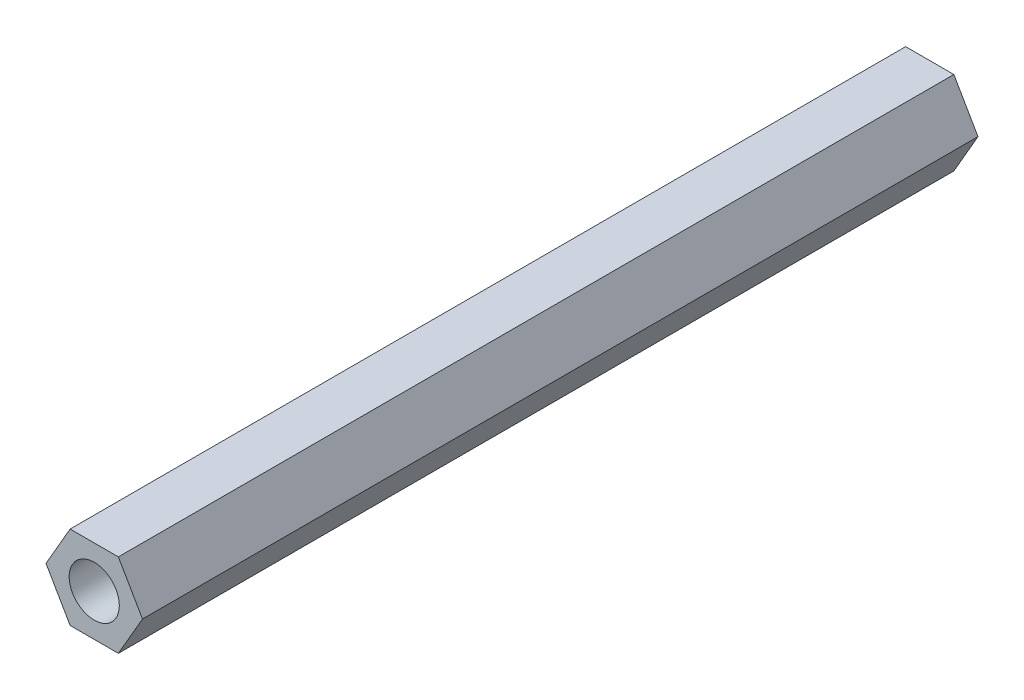
ISO-10303-21;
HEADER;
FILE_DESCRIPTION(('STEP AP214'),'2;1');
FILE_NAME('part.step','',(''),(''),'','','');
FILE_SCHEMA(('AUTOMOTIVE_DESIGN { 1 0 10303 214 1 1 1 1 }'));
ENDSEC;
DATA;
#1=APPLICATION_CONTEXT('core data for automotive mechanical design processes');
#2=APPLICATION_PROTOCOL_DEFINITION('international standard','automotive_design',2000,#1);
#3=PRODUCT_CONTEXT('',#1,'mechanical');
#4=PRODUCT('Part','Part','',(#3));
#5=PRODUCT_RELATED_PRODUCT_CATEGORY('part','',(#4));
#6=PRODUCT_DEFINITION_FORMATION('','',#4);
#7=PRODUCT_DEFINITION_CONTEXT('part definition',#1,'design');
#8=PRODUCT_DEFINITION('design','',#6,#7);
#9=PRODUCT_DEFINITION_SHAPE('','',#8);
#10=(LENGTH_UNIT() NAMED_UNIT(*) SI_UNIT(.MILLI.,.METRE.));
#11=(NAMED_UNIT(*) PLANE_ANGLE_UNIT() SI_UNIT($,.RADIAN.));
#12=(NAMED_UNIT(*) SI_UNIT($,.STERADIAN.) SOLID_ANGLE_UNIT());
#13=UNCERTAINTY_MEASURE_WITH_UNIT(LENGTH_MEASURE(1.E-05),#10,'distance_accuracy_value','');
#14=(GEOMETRIC_REPRESENTATION_CONTEXT(3) GLOBAL_UNCERTAINTY_ASSIGNED_CONTEXT((#13)) GLOBAL_UNIT_ASSIGNED_CONTEXT((#10,
#11,#12)) REPRESENTATION_CONTEXT('',''));
#15=CARTESIAN_POINT('',(0.,0.,0.));
#16=DIRECTION('',(0.,0.,1.));
#17=DIRECTION('',(1.,0.,0.));
#18=AXIS2_PLACEMENT_3D('',#15,#16,#17);
#19=CARTESIAN_POINT('',(1.44337567297406,-2.5,-50.));
#20=DIRECTION('',(0.866025403784439,-0.5,0.));
#21=DIRECTION('',(0.5,0.866025403784439,0.));
#22=AXIS2_PLACEMENT_3D('',#19,#20,#21);
#23=PLANE('',#22);
#24=DIRECTION('',(0.5,0.866025403784439,0.));
#25=VECTOR('',#24,1.);
#26=CARTESIAN_POINT('',(1.44337567297406,-2.5,0.));
#27=LINE('',#26,#25);
#28=CARTESIAN_POINT('',(1.44337567297406,-2.5,0.));
#29=VERTEX_POINT('',#28);
#30=CARTESIAN_POINT('',(2.88675134594813,0.,0.));
#31=VERTEX_POINT('',#30);
#32=EDGE_CURVE('E130',#29,#31,#27,.T.);
#33=ORIENTED_EDGE('',*,*,#32,.F.);
#34=DIRECTION('',(0.,0.,1.));
#35=VECTOR('',#34,1.);
#36=CARTESIAN_POINT('',(1.44337567297406,-2.5,-50.));
#37=LINE('',#36,#35);
#38=CARTESIAN_POINT('',(1.44337567297406,-2.5,-50.));
#39=VERTEX_POINT('',#38);
#40=EDGE_CURVE('E11',#39,#29,#37,.T.);
#41=ORIENTED_EDGE('',*,*,#40,.F.);
#42=DIRECTION('',(0.5,0.866025403784439,0.));
#43=VECTOR('',#42,1.);
#44=CARTESIAN_POINT('',(1.44337567297406,-2.5,-50.));
#45=LINE('',#44,#43);
#46=CARTESIAN_POINT('',(2.88675134594813,0.,-50.));
#47=VERTEX_POINT('',#46);
#48=EDGE_CURVE('E151',#39,#47,#45,.T.);
#49=ORIENTED_EDGE('',*,*,#48,.T.);
#50=DIRECTION('',(0.,0.,1.));
#51=VECTOR('',#50,1.);
#52=CARTESIAN_POINT('',(2.88675134594813,0.,-50.));
#53=LINE('',#52,#51);
#54=EDGE_CURVE('E42',#47,#31,#53,.T.);
#55=ORIENTED_EDGE('',*,*,#54,.T.);
#56=EDGE_LOOP('',(#33,#41,#49,#55));
#57=FACE_BOUND('',#56,.T.);
#58=ADVANCED_FACE('F39',(#57),#23,.T.);
#59=CARTESIAN_POINT('',(-1.44337567297406,-2.5,-50.));
#60=DIRECTION('',(0.,-1.,0.));
#61=DIRECTION('',(1.,0.,0.));
#62=AXIS2_PLACEMENT_3D('',#59,#60,#61);
#63=PLANE('',#62);
#64=DIRECTION('',(1.,0.,0.));
#65=VECTOR('',#64,1.);
#66=CARTESIAN_POINT('',(-1.44337567297406,-2.5,0.));
#67=LINE('',#66,#65);
#68=CARTESIAN_POINT('',(-1.44337567297406,-2.5,0.));
#69=VERTEX_POINT('',#68);
#70=EDGE_CURVE('E148',#69,#29,#67,.T.);
#71=ORIENTED_EDGE('',*,*,#70,.F.);
#72=DIRECTION('',(0.,0.,1.));
#73=VECTOR('',#72,1.);
#74=CARTESIAN_POINT('',(-1.44337567297406,-2.5,-50.));
#75=LINE('',#74,#73);
#76=CARTESIAN_POINT('',(-1.44337567297406,-2.5,-50.));
#77=VERTEX_POINT('',#76);
#78=EDGE_CURVE('E49',#77,#69,#75,.T.);
#79=ORIENTED_EDGE('',*,*,#78,.F.);
#80=DIRECTION('',(1.,0.,0.));
#81=VECTOR('',#80,1.);
#82=CARTESIAN_POINT('',(-1.44337567297406,-2.5,-50.));
#83=LINE('',#82,#81);
#84=EDGE_CURVE('E116',#77,#39,#83,.T.);
#85=ORIENTED_EDGE('',*,*,#84,.T.);
#86=ORIENTED_EDGE('',*,*,#40,.T.);
#87=EDGE_LOOP('',(#71,#79,#85,#86));
#88=FACE_BOUND('',#87,.T.);
#89=ADVANCED_FACE('F163',(#88),#63,.T.);
#90=CARTESIAN_POINT('',(-2.88675134594813,0.,-50.));
#91=DIRECTION('',(-0.866025403784439,-0.5,0.));
#92=DIRECTION('',(0.5,-0.866025403784439,0.));
#93=AXIS2_PLACEMENT_3D('',#90,#91,#92);
#94=PLANE('',#93);
#95=DIRECTION('',(0.5,-0.866025403784439,0.));
#96=VECTOR('',#95,1.);
#97=CARTESIAN_POINT('',(-2.88675134594813,0.,0.));
#98=LINE('',#97,#96);
#99=CARTESIAN_POINT('',(-2.88675134594813,0.,0.));
#100=VERTEX_POINT('',#99);
#101=EDGE_CURVE('E102',#100,#69,#98,.T.);
#102=ORIENTED_EDGE('',*,*,#101,.F.);
#103=DIRECTION('',(0.,0.,1.));
#104=VECTOR('',#103,1.);
#105=CARTESIAN_POINT('',(-2.88675134594813,0.,-50.));
#106=LINE('',#105,#104);
#107=CARTESIAN_POINT('',(-2.88675134594813,0.,-50.));
#108=VERTEX_POINT('',#107);
#109=EDGE_CURVE('E97',#108,#100,#106,.T.);
#110=ORIENTED_EDGE('',*,*,#109,.F.);
#111=DIRECTION('',(0.5,-0.866025403784439,0.));
#112=VECTOR('',#111,1.);
#113=CARTESIAN_POINT('',(-2.88675134594813,0.,-50.));
#114=LINE('',#113,#112);
#115=EDGE_CURVE('E100',#108,#77,#114,.T.);
#116=ORIENTED_EDGE('',*,*,#115,.T.);
#117=ORIENTED_EDGE('',*,*,#78,.T.);
#118=EDGE_LOOP('',(#102,#110,#116,#117));
#119=FACE_BOUND('',#118,.T.);
#120=ADVANCED_FACE('F99',(#119),#94,.T.);
#121=CARTESIAN_POINT('',(-1.44337567297406,2.5,-50.));
#122=DIRECTION('',(-0.866025403784439,0.5,0.));
#123=DIRECTION('',(-0.5,-0.866025403784439,0.));
#124=AXIS2_PLACEMENT_3D('',#121,#122,#123);
#125=PLANE('',#124);
#126=DIRECTION('',(-0.5,-0.866025403784439,0.));
#127=VECTOR('',#126,1.);
#128=CARTESIAN_POINT('',(-1.44337567297406,2.5,0.));
#129=LINE('',#128,#127);
#130=CARTESIAN_POINT('',(-1.44337567297406,2.5,0.));
#131=VERTEX_POINT('',#130);
#132=EDGE_CURVE('E143',#131,#100,#129,.T.);
#133=ORIENTED_EDGE('',*,*,#132,.F.);
#134=DIRECTION('',(0.,0.,1.));
#135=VECTOR('',#134,1.);
#136=CARTESIAN_POINT('',(-1.44337567297406,2.5,-50.));
#137=LINE('',#136,#135);
#138=CARTESIAN_POINT('',(-1.44337567297406,2.5,-50.));
#139=VERTEX_POINT('',#138);
#140=EDGE_CURVE('E108',#139,#131,#137,.T.);
#141=ORIENTED_EDGE('',*,*,#140,.F.);
#142=DIRECTION('',(-0.5,-0.866025403784439,0.));
#143=VECTOR('',#142,1.);
#144=CARTESIAN_POINT('',(-1.44337567297406,2.5,-50.));
#145=LINE('',#144,#143);
#146=EDGE_CURVE('E114',#139,#108,#145,.T.);
#147=ORIENTED_EDGE('',*,*,#146,.T.);
#148=ORIENTED_EDGE('',*,*,#109,.T.);
#149=EDGE_LOOP('',(#133,#141,#147,#148));
#150=FACE_BOUND('',#149,.T.);
#151=ADVANCED_FACE('F119',(#150),#125,.T.);
#152=CARTESIAN_POINT('',(1.44337567297406,2.5,-50.));
#153=DIRECTION('',(0.,1.,0.));
#154=DIRECTION('',(0.,0.,1.));
#155=AXIS2_PLACEMENT_3D('',#152,#153,#154);
#156=PLANE('',#155);
#157=DIRECTION('',(-1.,0.,0.));
#158=VECTOR('',#157,1.);
#159=CARTESIAN_POINT('',(1.44337567297406,2.5,0.));
#160=LINE('',#159,#158);
#161=CARTESIAN_POINT('',(1.44337567297406,2.5,0.));
#162=VERTEX_POINT('',#161);
#163=EDGE_CURVE('E139',#162,#131,#160,.T.);
#164=ORIENTED_EDGE('',*,*,#163,.F.);
#165=DIRECTION('',(0.,0.,1.));
#166=VECTOR('',#165,1.);
#167=CARTESIAN_POINT('',(1.44337567297406,2.5,-50.));
#168=LINE('',#167,#166);
#169=CARTESIAN_POINT('',(1.44337567297406,2.5,-50.));
#170=VERTEX_POINT('',#169);
#171=EDGE_CURVE('E156',#170,#162,#168,.T.);
#172=ORIENTED_EDGE('',*,*,#171,.F.);
#173=DIRECTION('',(-1.,0.,0.));
#174=VECTOR('',#173,1.);
#175=CARTESIAN_POINT('',(1.44337567297406,2.5,-50.));
#176=LINE('',#175,#174);
#177=EDGE_CURVE('E121',#170,#139,#176,.T.);
#178=ORIENTED_EDGE('',*,*,#177,.T.);
#179=ORIENTED_EDGE('',*,*,#140,.T.);
#180=EDGE_LOOP('',(#164,#172,#178,#179));
#181=FACE_BOUND('',#180,.T.);
#182=ADVANCED_FACE('F176',(#181),#156,.T.);
#183=CARTESIAN_POINT('',(2.88675134594813,0.,-50.));
#184=DIRECTION('',(0.866025403784439,0.5,0.));
#185=DIRECTION('',(-0.5,0.866025403784439,0.));
#186=AXIS2_PLACEMENT_3D('',#183,#184,#185);
#187=PLANE('',#186);
#188=DIRECTION('',(-0.5,0.866025403784439,0.));
#189=VECTOR('',#188,1.);
#190=CARTESIAN_POINT('',(2.88675134594813,0.,0.));
#191=LINE('',#190,#189);
#192=EDGE_CURVE('E134',#31,#162,#191,.T.);
#193=ORIENTED_EDGE('',*,*,#192,.F.);
#194=ORIENTED_EDGE('',*,*,#54,.F.);
#195=DIRECTION('',(-0.5,0.866025403784439,0.));
#196=VECTOR('',#195,1.);
#197=CARTESIAN_POINT('',(2.88675134594813,0.,-50.));
#198=LINE('',#197,#196);
#199=EDGE_CURVE('E124',#47,#170,#198,.T.);
#200=ORIENTED_EDGE('',*,*,#199,.T.);
#201=ORIENTED_EDGE('',*,*,#171,.T.);
#202=EDGE_LOOP('',(#193,#194,#200,#201));
#203=FACE_BOUND('',#202,.T.);
#204=ADVANCED_FACE('F160',(#203),#187,.T.);
#205=CARTESIAN_POINT('',(0.,0.,-50.));
#206=DIRECTION('',(0.,0.,1.));
#207=DIRECTION('',(1.,0.,0.));
#208=AXIS2_PLACEMENT_3D('',#205,#206,#207);
#209=PLANE('',#208);
#210=CARTESIAN_POINT('',(0.,0.,-50.));
#211=DIRECTION('',(0.,0.,1.));
#212=DIRECTION('',(1.,0.,0.));
#213=AXIS2_PLACEMENT_3D('',#210,#211,#212);
#214=CIRCLE('',#213,1.5);
#215=CARTESIAN_POINT('',(1.5,0.,-50.));
#216=VERTEX_POINT('',#215);
#217=EDGE_CURVE('E135',#216,#216,#214,.T.);
#218=ORIENTED_EDGE('',*,*,#217,.T.);
#219=EDGE_LOOP('',(#218));
#220=FACE_BOUND('',#219,.T.);
#221=ORIENTED_EDGE('',*,*,#48,.F.);
#222=ORIENTED_EDGE('',*,*,#84,.F.);
#223=ORIENTED_EDGE('',*,*,#115,.F.);
#224=ORIENTED_EDGE('',*,*,#146,.F.);
#225=ORIENTED_EDGE('',*,*,#177,.F.);
#226=ORIENTED_EDGE('',*,*,#199,.F.);
#227=EDGE_LOOP('',(#221,#222,#223,#224,#225,#226));
#228=FACE_BOUND('',#227,.T.);
#229=ADVANCED_FACE('F112',(#220,#228),#209,.F.);
#230=CARTESIAN_POINT('',(0.,0.,0.));
#231=DIRECTION('',(0.,0.,1.));
#232=DIRECTION('',(1.,0.,0.));
#233=AXIS2_PLACEMENT_3D('',#230,#231,#232);
#234=PLANE('',#233);
#235=CARTESIAN_POINT('',(0.,0.,0.));
#236=DIRECTION('',(0.,0.,1.));
#237=DIRECTION('',(1.,0.,0.));
#238=AXIS2_PLACEMENT_3D('',#235,#236,#237);
#239=CIRCLE('',#238,1.5);
#240=CARTESIAN_POINT('',(1.5,0.,0.));
#241=VERTEX_POINT('',#240);
#242=EDGE_CURVE('E199',#241,#241,#239,.T.);
#243=ORIENTED_EDGE('',*,*,#242,.F.);
#244=EDGE_LOOP('',(#243));
#245=FACE_BOUND('',#244,.T.);
#246=ORIENTED_EDGE('',*,*,#32,.T.);
#247=ORIENTED_EDGE('',*,*,#192,.T.);
#248=ORIENTED_EDGE('',*,*,#163,.T.);
#249=ORIENTED_EDGE('',*,*,#132,.T.);
#250=ORIENTED_EDGE('',*,*,#101,.T.);
#251=ORIENTED_EDGE('',*,*,#70,.T.);
#252=EDGE_LOOP('',(#246,#247,#248,#249,#250,#251));
#253=FACE_BOUND('',#252,.T.);
#254=ADVANCED_FACE('F162',(#245,#253),#234,.T.);
#255=CARTESIAN_POINT('',(0.,0.,-50.));
#256=DIRECTION('',(0.,0.,1.));
#257=DIRECTION('',(1.,0.,0.));
#258=AXIS2_PLACEMENT_3D('',#255,#256,#257);
#259=CYLINDRICAL_SURFACE('',#258,1.5);
#260=ORIENTED_EDGE('',*,*,#217,.F.);
#261=EDGE_LOOP('',(#260));
#262=FACE_BOUND('',#261,.T.);
#263=ORIENTED_EDGE('',*,*,#242,.T.);
#264=EDGE_LOOP('',(#263));
#265=FACE_BOUND('',#264,.T.);
#266=ADVANCED_FACE('F187',(#262,#265),#259,.F.);
#267=CLOSED_SHELL('',(#58,#89,#120,#151,#182,#204,#229,#254,#266));
#268=MANIFOLD_SOLID_BREP('B2',#267);
#269=ADVANCED_BREP_SHAPE_REPRESENTATION('',(#18,#268),#14);
#270=SHAPE_DEFINITION_REPRESENTATION(#9,#269);
ENDSEC;
END-ISO-10303-21;
